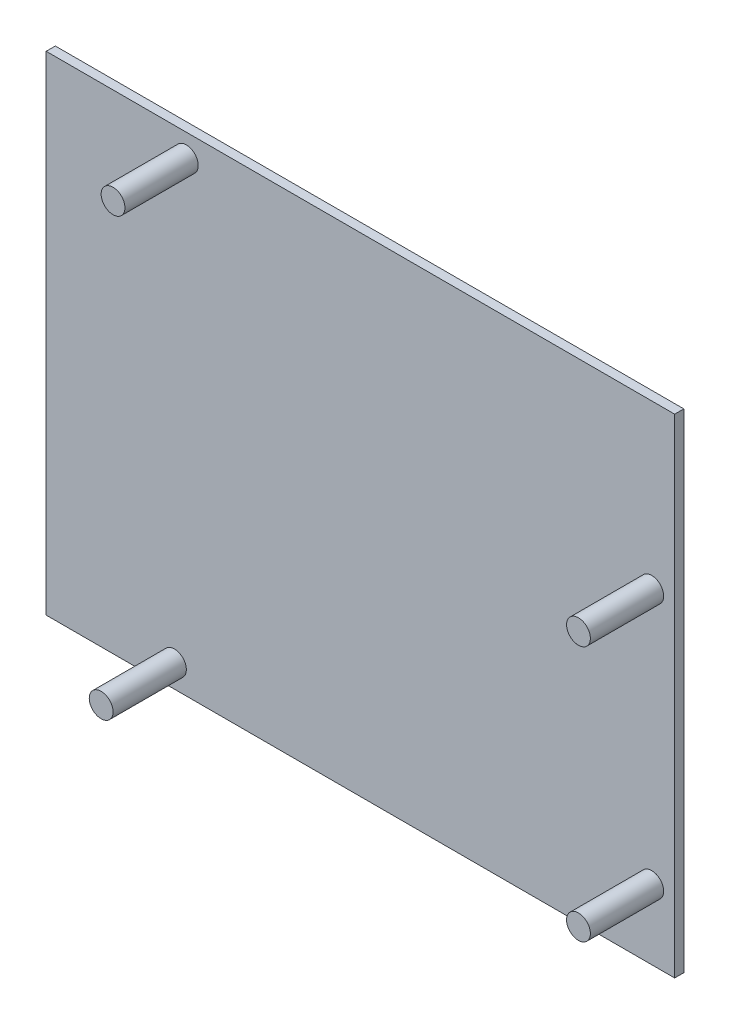
ISO-10303-21;
HEADER;
FILE_DESCRIPTION(('STEP AP214'),'2;1');
FILE_NAME('part.step','',(''),(''),'','','');
FILE_SCHEMA(('AUTOMOTIVE_DESIGN { 1 0 10303 214 1 1 1 1 }'));
ENDSEC;
DATA;
#1=APPLICATION_CONTEXT('core data for automotive mechanical design processes');
#2=APPLICATION_PROTOCOL_DEFINITION('international standard','automotive_design',2000,#1);
#3=PRODUCT_CONTEXT('',#1,'mechanical');
#4=PRODUCT('Part','Part','',(#3));
#5=PRODUCT_RELATED_PRODUCT_CATEGORY('part','',(#4));
#6=PRODUCT_DEFINITION_FORMATION('','',#4);
#7=PRODUCT_DEFINITION_CONTEXT('part definition',#1,'design');
#8=PRODUCT_DEFINITION('design','',#6,#7);
#9=PRODUCT_DEFINITION_SHAPE('','',#8);
#10=(LENGTH_UNIT() NAMED_UNIT(*) SI_UNIT(.MILLI.,.METRE.));
#11=(NAMED_UNIT(*) PLANE_ANGLE_UNIT() SI_UNIT($,.RADIAN.));
#12=(NAMED_UNIT(*) SI_UNIT($,.STERADIAN.) SOLID_ANGLE_UNIT());
#13=UNCERTAINTY_MEASURE_WITH_UNIT(LENGTH_MEASURE(1.E-05),#10,'distance_accuracy_value','');
#14=(GEOMETRIC_REPRESENTATION_CONTEXT(3) GLOBAL_UNCERTAINTY_ASSIGNED_CONTEXT((#13)) GLOBAL_UNIT_ASSIGNED_CONTEXT((#10,
#11,#12)) REPRESENTATION_CONTEXT('',''));
#15=CARTESIAN_POINT('',(0.,0.,0.));
#16=DIRECTION('',(0.,0.,1.));
#17=DIRECTION('',(1.,0.,0.));
#18=AXIS2_PLACEMENT_3D('',#15,#16,#17);
#19=CARTESIAN_POINT('',(0.,53.3,1.));
#20=DIRECTION('',(0.,0.,-1.));
#21=DIRECTION('',(-1.,0.,0.));
#22=AXIS2_PLACEMENT_3D('',#19,#20,#21);
#23=PLANE('',#22);
#24=CARTESIAN_POINT('',(15.3,50.8,1.));
#25=DIRECTION('',(0.,0.,-1.));
#26=DIRECTION('',(-1.,0.,0.));
#27=AXIS2_PLACEMENT_3D('',#24,#25,#26);
#28=CIRCLE('',#27,1.3);
#29=CARTESIAN_POINT('',(14.,50.8,1.));
#30=VERTEX_POINT('',#29);
#31=EDGE_CURVE('E42',#30,#30,#28,.F.);
#32=ORIENTED_EDGE('',*,*,#31,.F.);
#33=EDGE_LOOP('',(#32));
#34=FACE_BOUND('',#33,.T.);
#35=CARTESIAN_POINT('',(14.,2.5,1.));
#36=DIRECTION('',(0.,0.,-1.));
#37=DIRECTION('',(-1.,0.,0.));
#38=AXIS2_PLACEMENT_3D('',#35,#36,#37);
#39=CIRCLE('',#38,1.3);
#40=CARTESIAN_POINT('',(12.7,2.5,1.));
#41=VERTEX_POINT('',#40);
#42=EDGE_CURVE('E111',#41,#41,#39,.F.);
#43=ORIENTED_EDGE('',*,*,#42,.F.);
#44=EDGE_LOOP('',(#43));
#45=FACE_BOUND('',#44,.T.);
#46=DIRECTION('',(0.,-1.,0.));
#47=VECTOR('',#46,1.);
#48=CARTESIAN_POINT('',(0.,0.,1.));
#49=LINE('',#48,#47);
#50=CARTESIAN_POINT('',(0.,53.3,1.));
#51=VERTEX_POINT('',#50);
#52=CARTESIAN_POINT('',(0.,0.,1.));
#53=VERTEX_POINT('',#52);
#54=EDGE_CURVE('E86',#51,#53,#49,.T.);
#55=ORIENTED_EDGE('',*,*,#54,.T.);
#56=DIRECTION('',(1.,0.,0.));
#57=VECTOR('',#56,1.);
#58=CARTESIAN_POINT('',(0.,0.,1.));
#59=LINE('',#58,#57);
#60=CARTESIAN_POINT('',(68.6,0.,1.));
#61=VERTEX_POINT('',#60);
#62=EDGE_CURVE('E81',#53,#61,#59,.T.);
#63=ORIENTED_EDGE('',*,*,#62,.T.);
#64=DIRECTION('',(0.,1.,0.));
#65=VECTOR('',#64,1.);
#66=CARTESIAN_POINT('',(68.6,0.,1.));
#67=LINE('',#66,#65);
#68=CARTESIAN_POINT('',(68.6,53.3,1.));
#69=VERTEX_POINT('',#68);
#70=EDGE_CURVE('E84',#61,#69,#67,.T.);
#71=ORIENTED_EDGE('',*,*,#70,.T.);
#72=DIRECTION('',(-1.,0.,0.));
#73=VECTOR('',#72,1.);
#74=CARTESIAN_POINT('',(0.,53.3,1.));
#75=LINE('',#74,#73);
#76=EDGE_CURVE('E50',#69,#51,#75,.T.);
#77=ORIENTED_EDGE('',*,*,#76,.T.);
#78=EDGE_LOOP('',(#55,#63,#71,#77));
#79=FACE_BOUND('',#78,.T.);
#80=CARTESIAN_POINT('',(66.1,7.6,1.));
#81=DIRECTION('',(0.,0.,-1.));
#82=DIRECTION('',(-1.,0.,0.));
#83=AXIS2_PLACEMENT_3D('',#80,#81,#82);
#84=CIRCLE('',#83,1.29999999999999);
#85=CARTESIAN_POINT('',(64.8,7.6,1.));
#86=VERTEX_POINT('',#85);
#87=EDGE_CURVE('E114',#86,#86,#84,.F.);
#88=ORIENTED_EDGE('',*,*,#87,.F.);
#89=EDGE_LOOP('',(#88));
#90=FACE_BOUND('',#89,.T.);
#91=CARTESIAN_POINT('',(66.1,35.5,1.));
#92=DIRECTION('',(0.,0.,-1.));
#93=DIRECTION('',(-1.,0.,0.));
#94=AXIS2_PLACEMENT_3D('',#91,#92,#93);
#95=CIRCLE('',#94,1.29999999999999);
#96=CARTESIAN_POINT('',(64.8,35.5,1.));
#97=VERTEX_POINT('',#96);
#98=EDGE_CURVE('E11',#97,#97,#95,.F.);
#99=ORIENTED_EDGE('',*,*,#98,.F.);
#100=EDGE_LOOP('',(#99));
#101=FACE_BOUND('',#100,.T.);
#102=ADVANCED_FACE('F33',(#34,#45,#79,#90,#101),#23,.F.);
#103=CARTESIAN_POINT('',(0.,0.,1.));
#104=DIRECTION('',(1.,0.,0.));
#105=DIRECTION('',(0.,0.,-1.));
#106=AXIS2_PLACEMENT_3D('',#103,#104,#105);
#107=PLANE('',#106);
#108=DIRECTION('',(0.,-1.,0.));
#109=VECTOR('',#108,1.);
#110=CARTESIAN_POINT('',(0.,0.,0.));
#111=LINE('',#110,#109);
#112=CARTESIAN_POINT('',(0.,53.3,0.));
#113=VERTEX_POINT('',#112);
#114=CARTESIAN_POINT('',(0.,0.,0.));
#115=VERTEX_POINT('',#114);
#116=EDGE_CURVE('E101',#113,#115,#111,.T.);
#117=ORIENTED_EDGE('',*,*,#116,.T.);
#118=DIRECTION('',(0.,0.,-1.));
#119=VECTOR('',#118,1.);
#120=CARTESIAN_POINT('',(0.,0.,1.));
#121=LINE('',#120,#119);
#122=EDGE_CURVE('E92',#53,#115,#121,.T.);
#123=ORIENTED_EDGE('',*,*,#122,.F.);
#124=ORIENTED_EDGE('',*,*,#54,.F.);
#125=DIRECTION('',(0.,0.,-1.));
#126=VECTOR('',#125,1.);
#127=CARTESIAN_POINT('',(0.,53.3,1.));
#128=LINE('',#127,#126);
#129=EDGE_CURVE('E97',#51,#113,#128,.T.);
#130=ORIENTED_EDGE('',*,*,#129,.T.);
#131=EDGE_LOOP('',(#117,#123,#124,#130));
#132=FACE_BOUND('',#131,.T.);
#133=ADVANCED_FACE('F35',(#132),#107,.F.);
#134=CARTESIAN_POINT('',(0.,0.,1.));
#135=DIRECTION('',(0.,1.,0.));
#136=DIRECTION('',(0.,0.,1.));
#137=AXIS2_PLACEMENT_3D('',#134,#135,#136);
#138=PLANE('',#137);
#139=DIRECTION('',(1.,0.,0.));
#140=VECTOR('',#139,1.);
#141=CARTESIAN_POINT('',(0.,0.,0.));
#142=LINE('',#141,#140);
#143=CARTESIAN_POINT('',(68.6,0.,0.));
#144=VERTEX_POINT('',#143);
#145=EDGE_CURVE('E91',#115,#144,#142,.T.);
#146=ORIENTED_EDGE('',*,*,#145,.T.);
#147=DIRECTION('',(0.,0.,-1.));
#148=VECTOR('',#147,1.);
#149=CARTESIAN_POINT('',(68.6,0.,1.));
#150=LINE('',#149,#148);
#151=EDGE_CURVE('E89',#61,#144,#150,.T.);
#152=ORIENTED_EDGE('',*,*,#151,.F.);
#153=ORIENTED_EDGE('',*,*,#62,.F.);
#154=ORIENTED_EDGE('',*,*,#122,.T.);
#155=EDGE_LOOP('',(#146,#152,#153,#154));
#156=FACE_BOUND('',#155,.T.);
#157=ADVANCED_FACE('F90',(#156),#138,.F.);
#158=CARTESIAN_POINT('',(68.6,0.,1.));
#159=DIRECTION('',(-1.,0.,0.));
#160=DIRECTION('',(0.,0.,1.));
#161=AXIS2_PLACEMENT_3D('',#158,#159,#160);
#162=PLANE('',#161);
#163=DIRECTION('',(0.,1.,0.));
#164=VECTOR('',#163,1.);
#165=CARTESIAN_POINT('',(68.6,0.,0.));
#166=LINE('',#165,#164);
#167=CARTESIAN_POINT('',(68.6,53.3,0.));
#168=VERTEX_POINT('',#167);
#169=EDGE_CURVE('E67',#144,#168,#166,.T.);
#170=ORIENTED_EDGE('',*,*,#169,.T.);
#171=DIRECTION('',(0.,0.,-1.));
#172=VECTOR('',#171,1.);
#173=CARTESIAN_POINT('',(68.6,53.3,1.));
#174=LINE('',#173,#172);
#175=EDGE_CURVE('E93',#69,#168,#174,.T.);
#176=ORIENTED_EDGE('',*,*,#175,.F.);
#177=ORIENTED_EDGE('',*,*,#70,.F.);
#178=ORIENTED_EDGE('',*,*,#151,.T.);
#179=EDGE_LOOP('',(#170,#176,#177,#178));
#180=FACE_BOUND('',#179,.T.);
#181=ADVANCED_FACE('F95',(#180),#162,.F.);
#182=CARTESIAN_POINT('',(0.,53.3,1.));
#183=DIRECTION('',(0.,-1.,0.));
#184=DIRECTION('',(0.,0.,-1.));
#185=AXIS2_PLACEMENT_3D('',#182,#183,#184);
#186=PLANE('',#185);
#187=DIRECTION('',(-1.,0.,0.));
#188=VECTOR('',#187,1.);
#189=CARTESIAN_POINT('',(0.,53.3,0.));
#190=LINE('',#189,#188);
#191=EDGE_CURVE('E73',#168,#113,#190,.T.);
#192=ORIENTED_EDGE('',*,*,#191,.T.);
#193=ORIENTED_EDGE('',*,*,#129,.F.);
#194=ORIENTED_EDGE('',*,*,#76,.F.);
#195=ORIENTED_EDGE('',*,*,#175,.T.);
#196=EDGE_LOOP('',(#192,#193,#194,#195));
#197=FACE_BOUND('',#196,.T.);
#198=ADVANCED_FACE('F139',(#197),#186,.F.);
#199=CARTESIAN_POINT('',(0.,53.3,0.));
#200=DIRECTION('',(0.,0.,-1.));
#201=DIRECTION('',(-1.,0.,0.));
#202=AXIS2_PLACEMENT_3D('',#199,#200,#201);
#203=PLANE('',#202);
#204=ORIENTED_EDGE('',*,*,#116,.F.);
#205=ORIENTED_EDGE('',*,*,#191,.F.);
#206=ORIENTED_EDGE('',*,*,#169,.F.);
#207=ORIENTED_EDGE('',*,*,#145,.F.);
#208=EDGE_LOOP('',(#204,#205,#206,#207));
#209=FACE_BOUND('',#208,.T.);
#210=ADVANCED_FACE('F129',(#209),#203,.T.);
#211=CARTESIAN_POINT('',(14.,2.5,9.));
#212=DIRECTION('',(0.,0.,-1.));
#213=DIRECTION('',(-1.,0.,0.));
#214=AXIS2_PLACEMENT_3D('',#211,#212,#213);
#215=CYLINDRICAL_SURFACE('',#214,1.3);
#216=CARTESIAN_POINT('',(14.,2.5,9.));
#217=DIRECTION('',(0.,0.,1.));
#218=DIRECTION('',(1.,0.,0.));
#219=AXIS2_PLACEMENT_3D('',#216,#217,#218);
#220=CIRCLE('',#219,1.3);
#221=CARTESIAN_POINT('',(15.3,2.5,9.));
#222=VERTEX_POINT('',#221);
#223=EDGE_CURVE('E104',#222,#222,#220,.T.);
#224=ORIENTED_EDGE('',*,*,#223,.F.);
#225=EDGE_LOOP('',(#224));
#226=FACE_BOUND('',#225,.T.);
#227=ORIENTED_EDGE('',*,*,#42,.T.);
#228=EDGE_LOOP('',(#227));
#229=FACE_BOUND('',#228,.T.);
#230=ADVANCED_FACE('F126',(#226,#229),#215,.T.);
#231=CARTESIAN_POINT('',(14.,2.5,9.));
#232=DIRECTION('',(0.,0.,1.));
#233=DIRECTION('',(1.,0.,0.));
#234=AXIS2_PLACEMENT_3D('',#231,#232,#233);
#235=PLANE('',#234);
#236=ORIENTED_EDGE('',*,*,#223,.T.);
#237=EDGE_LOOP('',(#236));
#238=FACE_BOUND('',#237,.T.);
#239=ADVANCED_FACE('F128',(#238),#235,.T.);
#240=CARTESIAN_POINT('',(66.1,7.6,9.));
#241=DIRECTION('',(0.,0.,-1.));
#242=DIRECTION('',(-1.,0.,0.));
#243=AXIS2_PLACEMENT_3D('',#240,#241,#242);
#244=CYLINDRICAL_SURFACE('',#243,1.29999999999999);
#245=CARTESIAN_POINT('',(66.1,7.6,9.));
#246=DIRECTION('',(0.,0.,1.));
#247=DIRECTION('',(1.,0.,0.));
#248=AXIS2_PLACEMENT_3D('',#245,#246,#247);
#249=CIRCLE('',#248,1.29999999999999);
#250=CARTESIAN_POINT('',(67.4,7.6,9.));
#251=VERTEX_POINT('',#250);
#252=EDGE_CURVE('E159',#251,#251,#249,.T.);
#253=ORIENTED_EDGE('',*,*,#252,.F.);
#254=EDGE_LOOP('',(#253));
#255=FACE_BOUND('',#254,.T.);
#256=ORIENTED_EDGE('',*,*,#87,.T.);
#257=EDGE_LOOP('',(#256));
#258=FACE_BOUND('',#257,.T.);
#259=ADVANCED_FACE('F136',(#255,#258),#244,.T.);
#260=CARTESIAN_POINT('',(66.1,7.6,9.));
#261=DIRECTION('',(0.,0.,1.));
#262=DIRECTION('',(1.,0.,0.));
#263=AXIS2_PLACEMENT_3D('',#260,#261,#262);
#264=PLANE('',#263);
#265=ORIENTED_EDGE('',*,*,#252,.T.);
#266=EDGE_LOOP('',(#265));
#267=FACE_BOUND('',#266,.T.);
#268=ADVANCED_FACE('F188',(#267),#264,.T.);
#269=CARTESIAN_POINT('',(15.3,50.8,9.));
#270=DIRECTION('',(0.,0.,-1.));
#271=DIRECTION('',(-1.,0.,0.));
#272=AXIS2_PLACEMENT_3D('',#269,#270,#271);
#273=CYLINDRICAL_SURFACE('',#272,1.3);
#274=CARTESIAN_POINT('',(15.3,50.8,9.));
#275=DIRECTION('',(0.,0.,1.));
#276=DIRECTION('',(1.,0.,0.));
#277=AXIS2_PLACEMENT_3D('',#274,#275,#276);
#278=CIRCLE('',#277,1.3);
#279=CARTESIAN_POINT('',(16.6,50.8,9.));
#280=VERTEX_POINT('',#279);
#281=EDGE_CURVE('E162',#280,#280,#278,.T.);
#282=ORIENTED_EDGE('',*,*,#281,.F.);
#283=EDGE_LOOP('',(#282));
#284=FACE_BOUND('',#283,.T.);
#285=ORIENTED_EDGE('',*,*,#31,.T.);
#286=EDGE_LOOP('',(#285));
#287=FACE_BOUND('',#286,.T.);
#288=ADVANCED_FACE('F119',(#284,#287),#273,.T.);
#289=CARTESIAN_POINT('',(15.3,50.8,9.));
#290=DIRECTION('',(0.,0.,1.));
#291=DIRECTION('',(1.,0.,0.));
#292=AXIS2_PLACEMENT_3D('',#289,#290,#291);
#293=PLANE('',#292);
#294=ORIENTED_EDGE('',*,*,#281,.T.);
#295=EDGE_LOOP('',(#294));
#296=FACE_BOUND('',#295,.T.);
#297=ADVANCED_FACE('F174',(#296),#293,.T.);
#298=CARTESIAN_POINT('',(66.1,35.5,9.));
#299=DIRECTION('',(0.,0.,-1.));
#300=DIRECTION('',(-1.,0.,0.));
#301=AXIS2_PLACEMENT_3D('',#298,#299,#300);
#302=CYLINDRICAL_SURFACE('',#301,1.29999999999999);
#303=CARTESIAN_POINT('',(66.1,35.5,9.));
#304=DIRECTION('',(0.,0.,1.));
#305=DIRECTION('',(1.,0.,0.));
#306=AXIS2_PLACEMENT_3D('',#303,#304,#305);
#307=CIRCLE('',#306,1.29999999999999);
#308=CARTESIAN_POINT('',(67.4,35.5,9.));
#309=VERTEX_POINT('',#308);
#310=EDGE_CURVE('E165',#309,#309,#307,.T.);
#311=ORIENTED_EDGE('',*,*,#310,.F.);
#312=EDGE_LOOP('',(#311));
#313=FACE_BOUND('',#312,.T.);
#314=ORIENTED_EDGE('',*,*,#98,.T.);
#315=EDGE_LOOP('',(#314));
#316=FACE_BOUND('',#315,.T.);
#317=ADVANCED_FACE('F171',(#313,#316),#302,.T.);
#318=CARTESIAN_POINT('',(66.1,35.5,9.));
#319=DIRECTION('',(0.,0.,1.));
#320=DIRECTION('',(1.,0.,0.));
#321=AXIS2_PLACEMENT_3D('',#318,#319,#320);
#322=PLANE('',#321);
#323=ORIENTED_EDGE('',*,*,#310,.T.);
#324=EDGE_LOOP('',(#323));
#325=FACE_BOUND('',#324,.T.);
#326=ADVANCED_FACE('F169',(#325),#322,.T.);
#327=CLOSED_SHELL('',(#102,#133,#157,#181,#198,#210,#230,#239,#259,#268,#288,#297,#317,#326));
#328=MANIFOLD_SOLID_BREP('B2',#327);
#329=ADVANCED_BREP_SHAPE_REPRESENTATION('',(#18,#328),#14);
#330=SHAPE_DEFINITION_REPRESENTATION(#9,#329);
ENDSEC;
END-ISO-10303-21;
